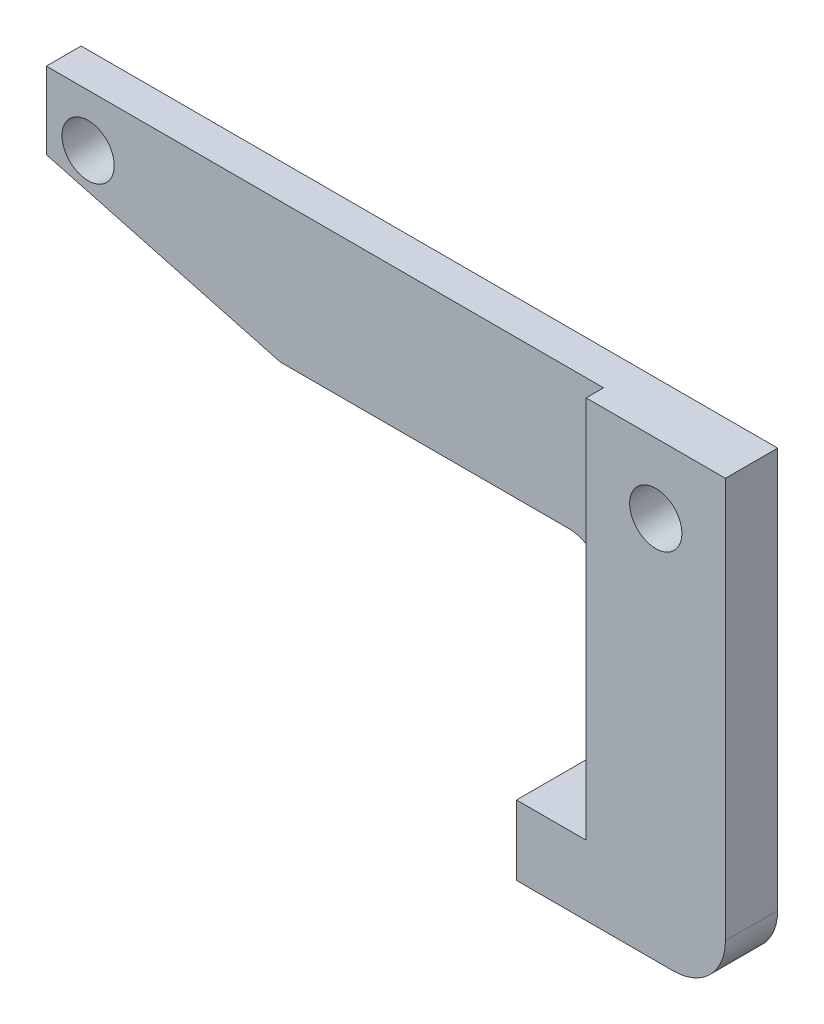
ISO-10303-21;
HEADER;
FILE_DESCRIPTION(('STEP AP214'),'2;1');
FILE_NAME('part.step','',(''),(''),'','','');
FILE_SCHEMA(('AUTOMOTIVE_DESIGN { 1 0 10303 214 1 1 1 1 }'));
ENDSEC;
DATA;
#1=APPLICATION_CONTEXT('core data for automotive mechanical design processes');
#2=APPLICATION_PROTOCOL_DEFINITION('international standard','automotive_design',2000,#1);
#3=PRODUCT_CONTEXT('',#1,'mechanical');
#4=PRODUCT('Part','Part','',(#3));
#5=PRODUCT_RELATED_PRODUCT_CATEGORY('part','',(#4));
#6=PRODUCT_DEFINITION_FORMATION('','',#4);
#7=PRODUCT_DEFINITION_CONTEXT('part definition',#1,'design');
#8=PRODUCT_DEFINITION('design','',#6,#7);
#9=PRODUCT_DEFINITION_SHAPE('','',#8);
#10=(LENGTH_UNIT() NAMED_UNIT(*) SI_UNIT(.MILLI.,.METRE.));
#11=(NAMED_UNIT(*) PLANE_ANGLE_UNIT() SI_UNIT($,.RADIAN.));
#12=(NAMED_UNIT(*) SI_UNIT($,.STERADIAN.) SOLID_ANGLE_UNIT());
#13=UNCERTAINTY_MEASURE_WITH_UNIT(LENGTH_MEASURE(1.E-05),#10,'distance_accuracy_value','');
#14=(GEOMETRIC_REPRESENTATION_CONTEXT(3) GLOBAL_UNCERTAINTY_ASSIGNED_CONTEXT((#13)) GLOBAL_UNIT_ASSIGNED_CONTEXT((#10,
#11,#12)) REPRESENTATION_CONTEXT('',''));
#15=CARTESIAN_POINT('',(0.,0.,0.));
#16=DIRECTION('',(0.,0.,1.));
#17=DIRECTION('',(1.,0.,0.));
#18=AXIS2_PLACEMENT_3D('',#15,#16,#17);
#19=CARTESIAN_POINT('',(-114.3,-12.7,0.));
#20=DIRECTION('',(0.,0.,1.));
#21=DIRECTION('',(1.,0.,0.));
#22=AXIS2_PLACEMENT_3D('',#19,#20,#21);
#23=PLANE('',#22);
#24=DIRECTION('',(0.,-1.,0.));
#25=VECTOR('',#24,1.);
#26=CARTESIAN_POINT('',(9.52499999999998,-12.7,0.));
#27=LINE('',#26,#25);
#28=CARTESIAN_POINT('',(9.52499999999999,9.52499999999999,0.));
#29=VERTEX_POINT('',#28);
#30=CARTESIAN_POINT('',(9.52499999999998,0.,0.));
#31=VERTEX_POINT('',#30);
#32=EDGE_CURVE('E159',#29,#31,#27,.T.);
#33=ORIENTED_EDGE('',*,*,#32,.T.);
#34=CARTESIAN_POINT('',(0.,0.,0.));
#35=DIRECTION('',(0.,0.,-1.));
#36=DIRECTION('',(-1.,0.,0.));
#37=AXIS2_PLACEMENT_3D('',#34,#35,#36);
#38=CIRCLE('',#37,9.525);
#39=CARTESIAN_POINT('',(0.,9.52499999999999,0.));
#40=VERTEX_POINT('',#39);
#41=EDGE_CURVE('E53',#40,#31,#38,.T.);
#42=ORIENTED_EDGE('',*,*,#41,.F.);
#43=DIRECTION('',(1.,0.,0.));
#44=VECTOR('',#43,1.);
#45=CARTESIAN_POINT('',(-114.3,9.52499999999999,0.));
#46=LINE('',#45,#44);
#47=EDGE_CURVE('E156',#40,#29,#46,.T.);
#48=ORIENTED_EDGE('',*,*,#47,.T.);
#49=EDGE_LOOP('',(#33,#42,#48));
#50=FACE_BOUND('',#49,.T.);
#51=ADVANCED_FACE('F37',(#50),#23,.F.);
#52=CARTESIAN_POINT('',(0.,0.,0.));
#53=DIRECTION('',(0.,0.,1.));
#54=DIRECTION('',(1.,0.,0.));
#55=AXIS2_PLACEMENT_3D('',#52,#53,#54);
#56=CYLINDRICAL_SURFACE('',#55,4.7625);
#57=CARTESIAN_POINT('',(0.,0.,12.7));
#58=DIRECTION('',(0.,0.,1.));
#59=DIRECTION('',(1.,0.,0.));
#60=AXIS2_PLACEMENT_3D('',#57,#58,#59);
#61=CIRCLE('',#60,4.7625);
#62=CARTESIAN_POINT('',(4.7625,0.,12.7));
#63=VERTEX_POINT('',#62);
#64=EDGE_CURVE('E215',#63,#63,#61,.T.);
#65=ORIENTED_EDGE('',*,*,#64,.T.);
#66=EDGE_LOOP('',(#65));
#67=FACE_BOUND('',#66,.T.);
#68=CARTESIAN_POINT('',(0.,0.,4.445));
#69=DIRECTION('',(0.,0.,-1.));
#70=DIRECTION('',(-1.,0.,0.));
#71=AXIS2_PLACEMENT_3D('',#68,#69,#70);
#72=CIRCLE('',#71,4.7625);
#73=CARTESIAN_POINT('',(-4.7625,0.,4.445));
#74=VERTEX_POINT('',#73);
#75=EDGE_CURVE('E41',#74,#74,#72,.F.);
#76=ORIENTED_EDGE('',*,*,#75,.F.);
#77=EDGE_LOOP('',(#76));
#78=FACE_BOUND('',#77,.T.);
#79=ADVANCED_FACE('F355',(#67,#78),#56,.F.);
#80=CARTESIAN_POINT('',(-114.3,12.7,12.7));
#81=DIRECTION('',(1.,0.,0.));
#82=DIRECTION('',(0.,0.,-1.));
#83=AXIS2_PLACEMENT_3D('',#80,#81,#82);
#84=PLANE('',#83);
#85=DIRECTION('',(0.,0.,-1.));
#86=VECTOR('',#85,1.);
#87=CARTESIAN_POINT('',(-114.3,12.7,12.7));
#88=LINE('',#87,#86);
#89=CARTESIAN_POINT('',(-114.3,12.7,9.525));
#90=VERTEX_POINT('',#89);
#91=CARTESIAN_POINT('',(-114.3,12.7,3.175));
#92=VERTEX_POINT('',#91);
#93=EDGE_CURVE('E233',#90,#92,#88,.T.);
#94=ORIENTED_EDGE('',*,*,#93,.T.);
#95=DIRECTION('',(0.,0.707106781186549,0.707106781186546));
#96=VECTOR('',#95,1.);
#97=CARTESIAN_POINT('',(-114.3,12.7,3.175));
#98=LINE('',#97,#96);
#99=CARTESIAN_POINT('',(-114.3,9.52499999999999,0.));
#100=VERTEX_POINT('',#99);
#101=EDGE_CURVE('E46',#92,#100,#98,.F.);
#102=ORIENTED_EDGE('',*,*,#101,.T.);
#103=DIRECTION('',(0.,-1.,0.));
#104=VECTOR('',#103,1.);
#105=CARTESIAN_POINT('',(-114.3,12.7,0.));
#106=LINE('',#105,#104);
#107=CARTESIAN_POINT('',(-114.3,-1.26999999999999,0.));
#108=VERTEX_POINT('',#107);
#109=EDGE_CURVE('E171',#100,#108,#106,.T.);
#110=ORIENTED_EDGE('',*,*,#109,.T.);
#111=DIRECTION('',(0.,0.,1.));
#112=VECTOR('',#111,1.);
#113=CARTESIAN_POINT('',(-114.3,-1.26999999999999,12.7));
#114=LINE('',#113,#112);
#115=CARTESIAN_POINT('',(-114.3,-1.26999999999999,9.525));
#116=VERTEX_POINT('',#115);
#117=EDGE_CURVE('E260',#108,#116,#114,.T.);
#118=ORIENTED_EDGE('',*,*,#117,.T.);
#119=DIRECTION('',(0.,-1.,0.));
#120=VECTOR('',#119,1.);
#121=CARTESIAN_POINT('',(-114.3,-12.7,9.525));
#122=LINE('',#121,#120);
#123=EDGE_CURVE('E198',#90,#116,#122,.T.);
#124=ORIENTED_EDGE('',*,*,#123,.F.);
#125=EDGE_LOOP('',(#94,#102,#110,#118,#124));
#126=FACE_BOUND('',#125,.T.);
#127=ADVANCED_FACE('F330',(#126),#84,.F.);
#128=CARTESIAN_POINT('',(-114.3,-12.7,12.7));
#129=DIRECTION('',(0.,1.,0.));
#130=DIRECTION('',(0.,0.,1.));
#131=AXIS2_PLACEMENT_3D('',#128,#129,#130);
#132=PLANE('',#131);
#133=DIRECTION('',(1.,0.,0.));
#134=VECTOR('',#133,1.);
#135=CARTESIAN_POINT('',(-114.3,-12.7,0.));
#136=LINE('',#135,#134);
#137=CARTESIAN_POINT('',(-71.6426592694879,-12.7,0.));
#138=VERTEX_POINT('',#137);
#139=CARTESIAN_POINT('',(-19.05,-12.7,0.));
#140=VERTEX_POINT('',#139);
#141=EDGE_CURVE('E235',#138,#140,#136,.T.);
#142=ORIENTED_EDGE('',*,*,#141,.T.);
#143=DIRECTION('',(0.,0.,-1.));
#144=VECTOR('',#143,1.);
#145=CARTESIAN_POINT('',(-19.05,-12.7,9.525));
#146=LINE('',#145,#144);
#147=CARTESIAN_POINT('',(-19.05,-12.7,9.525));
#148=VERTEX_POINT('',#147);
#149=EDGE_CURVE('E276',#140,#148,#146,.F.);
#150=ORIENTED_EDGE('',*,*,#149,.T.);
#151=DIRECTION('',(1.,0.,0.));
#152=VECTOR('',#151,1.);
#153=CARTESIAN_POINT('',(-12.7,-12.7,9.525));
#154=LINE('',#153,#152);
#155=CARTESIAN_POINT('',(-71.642659269488,-12.7,9.525));
#156=VERTEX_POINT('',#155);
#157=EDGE_CURVE('E203',#156,#148,#154,.T.);
#158=ORIENTED_EDGE('',*,*,#157,.F.);
#159=DIRECTION('',(0.,0.,-1.));
#160=VECTOR('',#159,1.);
#161=CARTESIAN_POINT('',(-71.6426592694879,-12.7,12.7));
#162=LINE('',#161,#160);
#163=EDGE_CURVE('E256',#156,#138,#162,.T.);
#164=ORIENTED_EDGE('',*,*,#163,.T.);
#165=EDGE_LOOP('',(#142,#150,#158,#164));
#166=FACE_BOUND('',#165,.T.);
#167=ADVANCED_FACE('F320',(#166),#132,.F.);
#168=CARTESIAN_POINT('',(-106.68,3.175,0.));
#169=DIRECTION('',(0.,0.,1.));
#170=DIRECTION('',(1.,0.,0.));
#171=AXIS2_PLACEMENT_3D('',#168,#169,#170);
#172=CYLINDRICAL_SURFACE('',#171,4.7625);
#173=CARTESIAN_POINT('',(-106.68,3.175,0.));
#174=DIRECTION('',(0.,0.,1.));
#175=DIRECTION('',(1.,0.,0.));
#176=AXIS2_PLACEMENT_3D('',#173,#174,#175);
#177=CIRCLE('',#176,4.7625);
#178=CARTESIAN_POINT('',(-101.9175,3.175,0.));
#179=VERTEX_POINT('',#178);
#180=EDGE_CURVE('E212',#179,#179,#177,.T.);
#181=ORIENTED_EDGE('',*,*,#180,.F.);
#182=EDGE_LOOP('',(#181));
#183=FACE_BOUND('',#182,.T.);
#184=CARTESIAN_POINT('',(-106.68,3.175,9.525));
#185=DIRECTION('',(0.,0.,1.));
#186=DIRECTION('',(1.,0.,0.));
#187=AXIS2_PLACEMENT_3D('',#184,#185,#186);
#188=CIRCLE('',#187,4.7625);
#189=CARTESIAN_POINT('',(-101.9175,3.175,9.525));
#190=VERTEX_POINT('',#189);
#191=EDGE_CURVE('E209',#190,#190,#188,.F.);
#192=ORIENTED_EDGE('',*,*,#191,.F.);
#193=EDGE_LOOP('',(#192));
#194=FACE_BOUND('',#193,.T.);
#195=ADVANCED_FACE('F373',(#183,#194),#172,.F.);
#196=CARTESIAN_POINT('',(-71.6426592694879,-12.7,12.7));
#197=DIRECTION('',(0.258819045102522,0.965925826289068,0.));
#198=DIRECTION('',(-0.965925826289068,0.258819045102522,0.));
#199=AXIS2_PLACEMENT_3D('',#196,#197,#198);
#200=PLANE('',#199);
#201=ORIENTED_EDGE('',*,*,#163,.F.);
#202=DIRECTION('',(0.965925826289068,-0.258819045102522,0.));
#203=VECTOR('',#202,1.);
#204=CARTESIAN_POINT('',(-71.6426592694879,-12.7,9.525));
#205=LINE('',#204,#203);
#206=EDGE_CURVE('E263',#156,#116,#205,.F.);
#207=ORIENTED_EDGE('',*,*,#206,.T.);
#208=ORIENTED_EDGE('',*,*,#117,.F.);
#209=DIRECTION('',(0.965925826289068,-0.258819045102522,0.));
#210=VECTOR('',#209,1.);
#211=CARTESIAN_POINT('',(-71.6426592694879,-12.7,0.));
#212=LINE('',#211,#210);
#213=EDGE_CURVE('E258',#138,#108,#212,.F.);
#214=ORIENTED_EDGE('',*,*,#213,.F.);
#215=EDGE_LOOP('',(#201,#207,#208,#214));
#216=FACE_BOUND('',#215,.T.);
#217=ADVANCED_FACE('F327',(#216),#200,.F.);
#218=CARTESIAN_POINT('',(-12.7,-12.7,12.7));
#219=DIRECTION('',(1.,0.,0.));
#220=DIRECTION('',(0.,1.,0.));
#221=AXIS2_PLACEMENT_3D('',#218,#219,#220);
#222=PLANE('',#221);
#223=DIRECTION('',(0.,1.,0.));
#224=VECTOR('',#223,1.);
#225=CARTESIAN_POINT('',(-12.7,-12.7,9.525));
#226=LINE('',#225,#224);
#227=CARTESIAN_POINT('',(-12.7,-19.05,9.525));
#228=VERTEX_POINT('',#227);
#229=CARTESIAN_POINT('',(-12.7,12.7,9.525));
#230=VERTEX_POINT('',#229);
#231=EDGE_CURVE('E189',#228,#230,#226,.T.);
#232=ORIENTED_EDGE('',*,*,#231,.F.);
#233=DIRECTION('',(0.,0.,-1.));
#234=VECTOR('',#233,1.);
#235=CARTESIAN_POINT('',(-12.7,-19.05,0.));
#236=LINE('',#235,#234);
#237=CARTESIAN_POINT('',(-12.7,-19.05,0.));
#238=VERTEX_POINT('',#237);
#239=EDGE_CURVE('E273',#228,#238,#236,.T.);
#240=ORIENTED_EDGE('',*,*,#239,.T.);
#241=DIRECTION('',(0.,-1.,0.));
#242=VECTOR('',#241,1.);
#243=CARTESIAN_POINT('',(-12.7,-12.7,0.));
#244=LINE('',#243,#242);
#245=CARTESIAN_POINT('',(-12.7,-57.15,0.));
#246=VERTEX_POINT('',#245);
#247=EDGE_CURVE('E238',#238,#246,#244,.T.);
#248=ORIENTED_EDGE('',*,*,#247,.T.);
#249=DIRECTION('',(0.,0.,-1.));
#250=VECTOR('',#249,1.);
#251=CARTESIAN_POINT('',(-12.7,-57.15,12.7));
#252=LINE('',#251,#250);
#253=CARTESIAN_POINT('',(-12.7,-57.15,12.7));
#254=VERTEX_POINT('',#253);
#255=EDGE_CURVE('E253',#254,#246,#252,.T.);
#256=ORIENTED_EDGE('',*,*,#255,.F.);
#257=DIRECTION('',(0.,-1.,0.));
#258=VECTOR('',#257,1.);
#259=CARTESIAN_POINT('',(-12.7,-12.7,12.7));
#260=LINE('',#259,#258);
#261=CARTESIAN_POINT('',(-12.7,12.7,12.7));
#262=VERTEX_POINT('',#261);
#263=EDGE_CURVE('E218',#262,#254,#260,.T.);
#264=ORIENTED_EDGE('',*,*,#263,.F.);
#265=DIRECTION('',(0.,0.,1.));
#266=VECTOR('',#265,1.);
#267=CARTESIAN_POINT('',(-12.7,12.7,9.525));
#268=LINE('',#267,#266);
#269=EDGE_CURVE('E206',#230,#262,#268,.T.);
#270=ORIENTED_EDGE('',*,*,#269,.F.);
#271=EDGE_LOOP('',(#232,#240,#248,#256,#264,#270));
#272=FACE_BOUND('',#271,.T.);
#273=ADVANCED_FACE('F312',(#272),#222,.F.);
#274=CARTESIAN_POINT('',(-12.7,-57.15,12.7));
#275=DIRECTION('',(0.,-1.,0.));
#276=DIRECTION('',(0.,0.,-1.));
#277=AXIS2_PLACEMENT_3D('',#274,#275,#276);
#278=PLANE('',#277);
#279=DIRECTION('',(-1.,0.,0.));
#280=VECTOR('',#279,1.);
#281=CARTESIAN_POINT('',(-12.7,-57.15,0.));
#282=LINE('',#281,#280);
#283=CARTESIAN_POINT('',(-25.4,-57.15,0.));
#284=VERTEX_POINT('',#283);
#285=EDGE_CURVE('E240',#246,#284,#282,.T.);
#286=ORIENTED_EDGE('',*,*,#285,.T.);
#287=DIRECTION('',(0.,0.,-1.));
#288=VECTOR('',#287,1.);
#289=CARTESIAN_POINT('',(-25.4,-57.15,12.7));
#290=LINE('',#289,#288);
#291=CARTESIAN_POINT('',(-25.4,-57.15,12.7));
#292=VERTEX_POINT('',#291);
#293=EDGE_CURVE('E250',#292,#284,#290,.T.);
#294=ORIENTED_EDGE('',*,*,#293,.F.);
#295=DIRECTION('',(-1.,0.,0.));
#296=VECTOR('',#295,1.);
#297=CARTESIAN_POINT('',(-12.7,-57.15,12.7));
#298=LINE('',#297,#296);
#299=EDGE_CURVE('E220',#254,#292,#298,.T.);
#300=ORIENTED_EDGE('',*,*,#299,.F.);
#301=ORIENTED_EDGE('',*,*,#255,.T.);
#302=EDGE_LOOP('',(#286,#294,#300,#301));
#303=FACE_BOUND('',#302,.T.);
#304=ADVANCED_FACE('F307',(#303),#278,.F.);
#305=CARTESIAN_POINT('',(-25.4,-57.15,12.7));
#306=DIRECTION('',(1.,0.,0.));
#307=DIRECTION('',(0.,1.,0.));
#308=AXIS2_PLACEMENT_3D('',#305,#306,#307);
#309=PLANE('',#308);
#310=DIRECTION('',(0.,-1.,0.));
#311=VECTOR('',#310,1.);
#312=CARTESIAN_POINT('',(-25.4,-57.15,0.));
#313=LINE('',#312,#311);
#314=CARTESIAN_POINT('',(-25.4,-66.675,0.));
#315=VERTEX_POINT('',#314);
#316=EDGE_CURVE('E221',#284,#315,#313,.T.);
#317=ORIENTED_EDGE('',*,*,#316,.T.);
#318=DIRECTION('',(0.,0.707106781186549,-0.707106781186546));
#319=VECTOR('',#318,1.);
#320=CARTESIAN_POINT('',(-25.4,-69.85,3.175));
#321=LINE('',#320,#319);
#322=CARTESIAN_POINT('',(-25.4,-69.85,3.175));
#323=VERTEX_POINT('',#322);
#324=EDGE_CURVE('E179',#315,#323,#321,.F.);
#325=ORIENTED_EDGE('',*,*,#324,.T.);
#326=DIRECTION('',(0.,0.,-1.));
#327=VECTOR('',#326,1.);
#328=CARTESIAN_POINT('',(-25.4,-69.85,12.7));
#329=LINE('',#328,#327);
#330=CARTESIAN_POINT('',(-25.4,-69.85,12.7));
#331=VERTEX_POINT('',#330);
#332=EDGE_CURVE('E247',#331,#323,#329,.T.);
#333=ORIENTED_EDGE('',*,*,#332,.F.);
#334=DIRECTION('',(0.,-1.,0.));
#335=VECTOR('',#334,1.);
#336=CARTESIAN_POINT('',(-25.4,-57.15,12.7));
#337=LINE('',#336,#335);
#338=EDGE_CURVE('E223',#292,#331,#337,.T.);
#339=ORIENTED_EDGE('',*,*,#338,.F.);
#340=ORIENTED_EDGE('',*,*,#293,.T.);
#341=EDGE_LOOP('',(#317,#325,#333,#339,#340));
#342=FACE_BOUND('',#341,.T.);
#343=ADVANCED_FACE('F301',(#342),#309,.F.);
#344=CARTESIAN_POINT('',(12.7,-69.85,12.7));
#345=DIRECTION('',(0.,1.,0.));
#346=DIRECTION('',(-1.,0.,0.));
#347=AXIS2_PLACEMENT_3D('',#344,#345,#346);
#348=PLANE('',#347);
#349=ORIENTED_EDGE('',*,*,#332,.T.);
#350=DIRECTION('',(1.,0.,0.));
#351=VECTOR('',#350,1.);
#352=CARTESIAN_POINT('',(12.7,-69.85,3.175));
#353=LINE('',#352,#351);
#354=CARTESIAN_POINT('',(3.17500000000001,-69.85,3.175));
#355=VERTEX_POINT('',#354);
#356=EDGE_CURVE('E281',#323,#355,#353,.T.);
#357=ORIENTED_EDGE('',*,*,#356,.T.);
#358=DIRECTION('',(0.,0.,-1.));
#359=VECTOR('',#358,1.);
#360=CARTESIAN_POINT('',(3.17500000000001,-69.85,12.7));
#361=LINE('',#360,#359);
#362=CARTESIAN_POINT('',(3.17500000000001,-69.85,12.7));
#363=VERTEX_POINT('',#362);
#364=EDGE_CURVE('E269',#355,#363,#361,.F.);
#365=ORIENTED_EDGE('',*,*,#364,.T.);
#366=DIRECTION('',(1.,0.,0.));
#367=VECTOR('',#366,1.);
#368=CARTESIAN_POINT('',(12.7,-69.85,12.7));
#369=LINE('',#368,#367);
#370=EDGE_CURVE('E225',#331,#363,#369,.T.);
#371=ORIENTED_EDGE('',*,*,#370,.F.);
#372=EDGE_LOOP('',(#349,#357,#365,#371));
#373=FACE_BOUND('',#372,.T.);
#374=ADVANCED_FACE('F345',(#373),#348,.F.);
#375=CARTESIAN_POINT('',(12.7,12.7,12.7));
#376=DIRECTION('',(-1.,0.,0.));
#377=DIRECTION('',(0.,-1.,0.));
#378=AXIS2_PLACEMENT_3D('',#375,#376,#377);
#379=PLANE('',#378);
#380=DIRECTION('',(0.,0.,-1.));
#381=VECTOR('',#380,1.);
#382=CARTESIAN_POINT('',(12.7,-60.325,12.7));
#383=LINE('',#382,#381);
#384=CARTESIAN_POINT('',(12.7,-60.325,12.7));
#385=VERTEX_POINT('',#384);
#386=CARTESIAN_POINT('',(12.7,-60.325,3.175));
#387=VERTEX_POINT('',#386);
#388=EDGE_CURVE('E266',#385,#387,#383,.T.);
#389=ORIENTED_EDGE('',*,*,#388,.T.);
#390=DIRECTION('',(0.,1.,0.));
#391=VECTOR('',#390,1.);
#392=CARTESIAN_POINT('',(12.7,12.7,3.175));
#393=LINE('',#392,#391);
#394=CARTESIAN_POINT('',(12.7,12.7,3.175));
#395=VERTEX_POINT('',#394);
#396=EDGE_CURVE('E11',#387,#395,#393,.T.);
#397=ORIENTED_EDGE('',*,*,#396,.T.);
#398=DIRECTION('',(0.,0.,-1.));
#399=VECTOR('',#398,1.);
#400=CARTESIAN_POINT('',(12.7,12.7,12.7));
#401=LINE('',#400,#399);
#402=CARTESIAN_POINT('',(12.7,12.7,12.7));
#403=VERTEX_POINT('',#402);
#404=EDGE_CURVE('E245',#403,#395,#401,.T.);
#405=ORIENTED_EDGE('',*,*,#404,.F.);
#406=DIRECTION('',(0.,1.,0.));
#407=VECTOR('',#406,1.);
#408=CARTESIAN_POINT('',(12.7,12.7,12.7));
#409=LINE('',#408,#407);
#410=EDGE_CURVE('E228',#385,#403,#409,.T.);
#411=ORIENTED_EDGE('',*,*,#410,.F.);
#412=EDGE_LOOP('',(#389,#397,#405,#411));
#413=FACE_BOUND('',#412,.T.);
#414=ADVANCED_FACE('F341',(#413),#379,.F.);
#415=CARTESIAN_POINT('',(-114.3,12.7,12.7));
#416=DIRECTION('',(0.,-1.,0.));
#417=DIRECTION('',(0.,0.,-1.));
#418=AXIS2_PLACEMENT_3D('',#415,#416,#417);
#419=PLANE('',#418);
#420=ORIENTED_EDGE('',*,*,#404,.T.);
#421=DIRECTION('',(-1.,0.,0.));
#422=VECTOR('',#421,1.);
#423=CARTESIAN_POINT('',(-114.3,12.7,3.175));
#424=LINE('',#423,#422);
#425=EDGE_CURVE('E61',#395,#92,#424,.T.);
#426=ORIENTED_EDGE('',*,*,#425,.T.);
#427=ORIENTED_EDGE('',*,*,#93,.F.);
#428=DIRECTION('',(-1.,0.,0.));
#429=VECTOR('',#428,1.);
#430=CARTESIAN_POINT('',(-12.7,12.7,9.525));
#431=LINE('',#430,#429);
#432=EDGE_CURVE('E193',#230,#90,#431,.T.);
#433=ORIENTED_EDGE('',*,*,#432,.F.);
#434=ORIENTED_EDGE('',*,*,#269,.T.);
#435=DIRECTION('',(-1.,0.,0.));
#436=VECTOR('',#435,1.);
#437=CARTESIAN_POINT('',(-114.3,12.7,12.7));
#438=LINE('',#437,#436);
#439=EDGE_CURVE('E230',#403,#262,#438,.T.);
#440=ORIENTED_EDGE('',*,*,#439,.F.);
#441=EDGE_LOOP('',(#420,#426,#427,#433,#434,#440));
#442=FACE_BOUND('',#441,.T.);
#443=ADVANCED_FACE('F331',(#442),#419,.F.);
#444=CARTESIAN_POINT('',(-114.3,-12.7,12.7));
#445=DIRECTION('',(0.,0.,1.));
#446=DIRECTION('',(1.,0.,0.));
#447=AXIS2_PLACEMENT_3D('',#444,#445,#446);
#448=PLANE('',#447);
#449=ORIENTED_EDGE('',*,*,#370,.T.);
#450=CARTESIAN_POINT('',(3.17500000000001,-60.325,12.7));
#451=DIRECTION('',(0.,0.,1.));
#452=DIRECTION('',(1.,0.,0.));
#453=AXIS2_PLACEMENT_3D('',#450,#451,#452);
#454=CIRCLE('',#453,9.525);
#455=EDGE_CURVE('E271',#363,#385,#454,.T.);
#456=ORIENTED_EDGE('',*,*,#455,.T.);
#457=ORIENTED_EDGE('',*,*,#410,.T.);
#458=ORIENTED_EDGE('',*,*,#439,.T.);
#459=ORIENTED_EDGE('',*,*,#263,.T.);
#460=ORIENTED_EDGE('',*,*,#299,.T.);
#461=ORIENTED_EDGE('',*,*,#338,.T.);
#462=EDGE_LOOP('',(#449,#456,#457,#458,#459,#460,#461));
#463=FACE_BOUND('',#462,.T.);
#464=ORIENTED_EDGE('',*,*,#64,.F.);
#465=EDGE_LOOP('',(#464));
#466=FACE_BOUND('',#465,.T.);
#467=ADVANCED_FACE('F334',(#463,#466),#448,.T.);
#468=ORIENTED_EDGE('',*,*,#180,.T.);
#469=EDGE_LOOP('',(#468));
#470=FACE_BOUND('',#469,.T.);
#471=EDGE_CURVE('E164',#100,#40,#46,.T.);
#472=ORIENTED_EDGE('',*,*,#471,.T.);
#473=EDGE_CURVE('E147',#31,#40,#38,.T.);
#474=ORIENTED_EDGE('',*,*,#473,.F.);
#475=CARTESIAN_POINT('',(9.525,-60.325,0.));
#476=VERTEX_POINT('',#475);
#477=EDGE_CURVE('E283',#31,#476,#27,.T.);
#478=ORIENTED_EDGE('',*,*,#477,.T.);
#479=CARTESIAN_POINT('',(3.17500000000001,-60.325,0.));
#480=DIRECTION('',(0.,0.,1.));
#481=DIRECTION('',(1.,0.,0.));
#482=AXIS2_PLACEMENT_3D('',#479,#480,#481);
#483=CIRCLE('',#482,6.34999999999999);
#484=CARTESIAN_POINT('',(3.17500000000001,-66.675,0.));
#485=VERTEX_POINT('',#484);
#486=EDGE_CURVE('E172',#476,#485,#483,.F.);
#487=ORIENTED_EDGE('',*,*,#486,.T.);
#488=DIRECTION('',(-1.,0.,0.));
#489=VECTOR('',#488,1.);
#490=CARTESIAN_POINT('',(-114.3,-66.675,0.));
#491=LINE('',#490,#489);
#492=EDGE_CURVE('E173',#485,#315,#491,.T.);
#493=ORIENTED_EDGE('',*,*,#492,.T.);
#494=ORIENTED_EDGE('',*,*,#316,.F.);
#495=ORIENTED_EDGE('',*,*,#285,.F.);
#496=ORIENTED_EDGE('',*,*,#247,.F.);
#497=CARTESIAN_POINT('',(-19.05,-19.05,0.));
#498=DIRECTION('',(0.,0.,1.));
#499=DIRECTION('',(1.,0.,0.));
#500=AXIS2_PLACEMENT_3D('',#497,#498,#499);
#501=CIRCLE('',#500,6.35);
#502=EDGE_CURVE('E278',#238,#140,#501,.T.);
#503=ORIENTED_EDGE('',*,*,#502,.T.);
#504=ORIENTED_EDGE('',*,*,#141,.F.);
#505=ORIENTED_EDGE('',*,*,#213,.T.);
#506=ORIENTED_EDGE('',*,*,#109,.F.);
#507=EDGE_LOOP('',(#472,#474,#478,#487,#493,#494,#495,#496,#503,#504,#505,#506));
#508=FACE_BOUND('',#507,.T.);
#509=ADVANCED_FACE('F169',(#470,#508),#23,.F.);
#510=CARTESIAN_POINT('',(-12.7,12.7,9.525));
#511=DIRECTION('',(0.,0.,1.));
#512=DIRECTION('',(1.,0.,0.));
#513=AXIS2_PLACEMENT_3D('',#510,#511,#512);
#514=PLANE('',#513);
#515=ORIENTED_EDGE('',*,*,#157,.T.);
#516=CARTESIAN_POINT('',(-19.05,-19.05,9.525));
#517=DIRECTION('',(0.,0.,1.));
#518=DIRECTION('',(1.,0.,0.));
#519=AXIS2_PLACEMENT_3D('',#516,#517,#518);
#520=CIRCLE('',#519,6.35);
#521=EDGE_CURVE('E280',#148,#228,#520,.F.);
#522=ORIENTED_EDGE('',*,*,#521,.T.);
#523=ORIENTED_EDGE('',*,*,#231,.T.);
#524=ORIENTED_EDGE('',*,*,#432,.T.);
#525=ORIENTED_EDGE('',*,*,#123,.T.);
#526=ORIENTED_EDGE('',*,*,#206,.F.);
#527=EDGE_LOOP('',(#515,#522,#523,#524,#525,#526));
#528=FACE_BOUND('',#527,.T.);
#529=ORIENTED_EDGE('',*,*,#191,.T.);
#530=EDGE_LOOP('',(#529));
#531=FACE_BOUND('',#530,.T.);
#532=ADVANCED_FACE('F322',(#528,#531),#514,.T.);
#533=CARTESIAN_POINT('',(3.17500000000001,-60.325,12.7));
#534=DIRECTION('',(0.,0.,-1.));
#535=DIRECTION('',(-1.,0.,0.));
#536=AXIS2_PLACEMENT_3D('',#533,#534,#535);
#537=CYLINDRICAL_SURFACE('',#536,9.525);
#538=ORIENTED_EDGE('',*,*,#364,.F.);
#539=CARTESIAN_POINT('',(3.17500000000001,-60.325,3.175));
#540=DIRECTION('',(0.,0.,1.));
#541=DIRECTION('',(1.,0.,0.));
#542=AXIS2_PLACEMENT_3D('',#539,#540,#541);
#543=CIRCLE('',#542,9.525);
#544=EDGE_CURVE('E181',#355,#387,#543,.T.);
#545=ORIENTED_EDGE('',*,*,#544,.T.);
#546=ORIENTED_EDGE('',*,*,#388,.F.);
#547=ORIENTED_EDGE('',*,*,#455,.F.);
#548=EDGE_LOOP('',(#538,#545,#546,#547));
#549=FACE_BOUND('',#548,.T.);
#550=ADVANCED_FACE('F343',(#549),#537,.T.);
#551=CARTESIAN_POINT('',(-19.05,-19.05,12.7));
#552=DIRECTION('',(0.,0.,1.));
#553=DIRECTION('',(1.,0.,0.));
#554=AXIS2_PLACEMENT_3D('',#551,#552,#553);
#555=CYLINDRICAL_SURFACE('',#554,6.35);
#556=ORIENTED_EDGE('',*,*,#521,.F.);
#557=ORIENTED_EDGE('',*,*,#149,.F.);
#558=ORIENTED_EDGE('',*,*,#502,.F.);
#559=ORIENTED_EDGE('',*,*,#239,.F.);
#560=EDGE_LOOP('',(#556,#557,#558,#559));
#561=FACE_BOUND('',#560,.T.);
#562=ADVANCED_FACE('F316',(#561),#555,.F.);
#563=CARTESIAN_POINT('',(-114.3,12.7,3.175));
#564=DIRECTION('',(0.,-0.707106781186546,0.707106781186549));
#565=DIRECTION('',(0.,-0.707106781186549,-0.707106781186546));
#566=AXIS2_PLACEMENT_3D('',#563,#564,#565);
#567=PLANE('',#566);
#568=ORIENTED_EDGE('',*,*,#101,.F.);
#569=ORIENTED_EDGE('',*,*,#425,.F.);
#570=DIRECTION('',(0.577350269189626,0.577350269189627,0.577350269189625));
#571=VECTOR('',#570,1.);
#572=CARTESIAN_POINT('',(12.7,12.7,3.175));
#573=LINE('',#572,#571);
#574=EDGE_CURVE('E166',#29,#395,#573,.T.);
#575=ORIENTED_EDGE('',*,*,#574,.F.);
#576=ORIENTED_EDGE('',*,*,#47,.F.);
#577=ORIENTED_EDGE('',*,*,#471,.F.);
#578=EDGE_LOOP('',(#568,#569,#575,#576,#577));
#579=FACE_BOUND('',#578,.T.);
#580=ADVANCED_FACE('F39',(#579),#567,.F.);
#581=CARTESIAN_POINT('',(12.7,12.7,3.175));
#582=DIRECTION('',(-0.707106781186546,0.,0.707106781186548));
#583=DIRECTION('',(0.707106781186549,0.,0.707106781186547));
#584=AXIS2_PLACEMENT_3D('',#581,#582,#583);
#585=PLANE('',#584);
#586=ORIENTED_EDGE('',*,*,#574,.T.);
#587=ORIENTED_EDGE('',*,*,#396,.F.);
#588=DIRECTION('',(0.707106781186549,0.,0.707106781186547));
#589=VECTOR('',#588,1.);
#590=CARTESIAN_POINT('',(9.525,-60.325,0.));
#591=LINE('',#590,#589);
#592=EDGE_CURVE('E187',#476,#387,#591,.T.);
#593=ORIENTED_EDGE('',*,*,#592,.F.);
#594=ORIENTED_EDGE('',*,*,#477,.F.);
#595=ORIENTED_EDGE('',*,*,#32,.F.);
#596=EDGE_LOOP('',(#586,#587,#593,#594,#595));
#597=FACE_BOUND('',#596,.T.);
#598=ADVANCED_FACE('F290',(#597),#585,.F.);
#599=CARTESIAN_POINT('',(3.17500000000001,-60.325,0.));
#600=DIRECTION('',(0.,0.,1.));
#601=DIRECTION('',(1.,0.,0.));
#602=AXIS2_PLACEMENT_3D('',#599,#600,#601);
#603=CONICAL_SURFACE('',#602,6.34999999999999,0.78539816339745);
#604=ORIENTED_EDGE('',*,*,#592,.T.);
#605=ORIENTED_EDGE('',*,*,#544,.F.);
#606=DIRECTION('',(0.,-0.707106781186549,0.707106781186546));
#607=VECTOR('',#606,1.);
#608=CARTESIAN_POINT('',(3.17500000000001,-66.675,0.));
#609=LINE('',#608,#607);
#610=EDGE_CURVE('E185',#485,#355,#609,.T.);
#611=ORIENTED_EDGE('',*,*,#610,.F.);
#612=ORIENTED_EDGE('',*,*,#486,.F.);
#613=EDGE_LOOP('',(#604,#605,#611,#612));
#614=FACE_BOUND('',#613,.T.);
#615=ADVANCED_FACE('F294',(#614),#603,.T.);
#616=CARTESIAN_POINT('',(12.7,-69.85,3.175));
#617=DIRECTION('',(0.,0.707106781186546,0.707106781186549));
#618=DIRECTION('',(0.,-0.707106781186549,0.707106781186546));
#619=AXIS2_PLACEMENT_3D('',#616,#617,#618);
#620=PLANE('',#619);
#621=ORIENTED_EDGE('',*,*,#324,.F.);
#622=ORIENTED_EDGE('',*,*,#492,.F.);
#623=ORIENTED_EDGE('',*,*,#610,.T.);
#624=ORIENTED_EDGE('',*,*,#356,.F.);
#625=EDGE_LOOP('',(#621,#622,#623,#624));
#626=FACE_BOUND('',#625,.T.);
#627=ADVANCED_FACE('F297',(#626),#620,.F.);
#628=CARTESIAN_POINT('',(0.,0.,4.445));
#629=DIRECTION('',(0.,0.,-1.));
#630=DIRECTION('',(-1.,0.,0.));
#631=AXIS2_PLACEMENT_3D('',#628,#629,#630);
#632=PLANE('',#631);
#633=CARTESIAN_POINT('',(0.,0.,4.445));
#634=DIRECTION('',(0.,0.,-1.));
#635=DIRECTION('',(-1.,0.,0.));
#636=AXIS2_PLACEMENT_3D('',#633,#634,#635);
#637=CIRCLE('',#636,9.525);
#638=CARTESIAN_POINT('',(-9.525,0.,4.445));
#639=VERTEX_POINT('',#638);
#640=EDGE_CURVE('E160',#639,#639,#637,.T.);
#641=ORIENTED_EDGE('',*,*,#640,.T.);
#642=EDGE_LOOP('',(#641));
#643=FACE_BOUND('',#642,.T.);
#644=ORIENTED_EDGE('',*,*,#75,.T.);
#645=EDGE_LOOP('',(#644));
#646=FACE_BOUND('',#645,.T.);
#647=ADVANCED_FACE('F387',(#643,#646),#632,.T.);
#648=CARTESIAN_POINT('',(0.,0.,4.445));
#649=DIRECTION('',(0.,0.,-1.));
#650=DIRECTION('',(-1.,0.,0.));
#651=AXIS2_PLACEMENT_3D('',#648,#649,#650);
#652=CYLINDRICAL_SURFACE('',#651,9.525);
#653=ORIENTED_EDGE('',*,*,#640,.F.);
#654=EDGE_LOOP('',(#653));
#655=FACE_BOUND('',#654,.T.);
#656=ORIENTED_EDGE('',*,*,#41,.T.);
#657=ORIENTED_EDGE('',*,*,#473,.T.);
#658=EDGE_LOOP('',(#656,#657));
#659=FACE_BOUND('',#658,.T.);
#660=ADVANCED_FACE('F148',(#655,#659),#652,.F.);
#661=CLOSED_SHELL('',(#51,#79,#127,#167,#195,#217,#273,#304,#343,#374,#414,#443,#467,#509,#532,
#550,#562,#580,#598,#615,#627,#647,#660));
#662=MANIFOLD_SOLID_BREP('B2',#661);
#663=ADVANCED_BREP_SHAPE_REPRESENTATION('',(#18,#662),#14);
#664=SHAPE_DEFINITION_REPRESENTATION(#9,#663);
ENDSEC;
END-ISO-10303-21;
